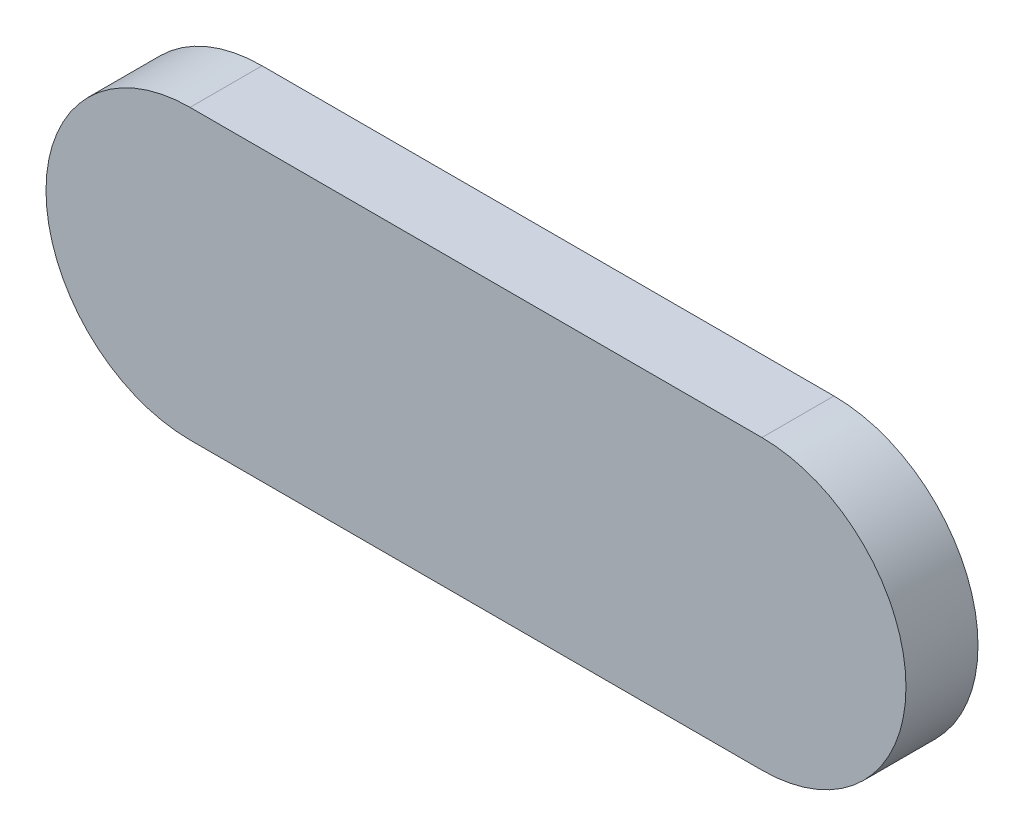
ISO-10303-21;
HEADER;
FILE_DESCRIPTION(('STEP AP214'),'2;1');
FILE_NAME('part.step','',(''),(''),'','','');
FILE_SCHEMA(('AUTOMOTIVE_DESIGN { 1 0 10303 214 1 1 1 1 }'));
ENDSEC;
DATA;
#1=APPLICATION_CONTEXT('core data for automotive mechanical design processes');
#2=APPLICATION_PROTOCOL_DEFINITION('international standard','automotive_design',2000,#1);
#3=PRODUCT_CONTEXT('',#1,'mechanical');
#4=PRODUCT('Part','Part','',(#3));
#5=PRODUCT_RELATED_PRODUCT_CATEGORY('part','',(#4));
#6=PRODUCT_DEFINITION_FORMATION('','',#4);
#7=PRODUCT_DEFINITION_CONTEXT('part definition',#1,'design');
#8=PRODUCT_DEFINITION('design','',#6,#7);
#9=PRODUCT_DEFINITION_SHAPE('','',#8);
#10=(LENGTH_UNIT() NAMED_UNIT(*) SI_UNIT(.MILLI.,.METRE.));
#11=(NAMED_UNIT(*) PLANE_ANGLE_UNIT() SI_UNIT($,.RADIAN.));
#12=(NAMED_UNIT(*) SI_UNIT($,.STERADIAN.) SOLID_ANGLE_UNIT());
#13=UNCERTAINTY_MEASURE_WITH_UNIT(LENGTH_MEASURE(1.E-05),#10,'distance_accuracy_value','');
#14=(GEOMETRIC_REPRESENTATION_CONTEXT(3) GLOBAL_UNCERTAINTY_ASSIGNED_CONTEXT((#13)) GLOBAL_UNIT_ASSIGNED_CONTEXT((#10,
#11,#12)) REPRESENTATION_CONTEXT('',''));
#15=CARTESIAN_POINT('',(0.,0.,0.));
#16=DIRECTION('',(0.,0.,1.));
#17=DIRECTION('',(1.,0.,0.));
#18=AXIS2_PLACEMENT_3D('',#15,#16,#17);
#19=CARTESIAN_POINT('',(-19.85,10.,5.));
#20=DIRECTION('',(0.,1.,0.));
#21=DIRECTION('',(0.,0.,1.));
#22=AXIS2_PLACEMENT_3D('',#19,#20,#21);
#23=PLANE('',#22);
#24=DIRECTION('',(1.,0.,0.));
#25=VECTOR('',#24,1.);
#26=CARTESIAN_POINT('',(-19.85,10.,0.));
#27=LINE('',#26,#25);
#28=CARTESIAN_POINT('',(-19.85,10.,0.));
#29=VERTEX_POINT('',#28);
#30=CARTESIAN_POINT('',(19.85,10.,0.));
#31=VERTEX_POINT('',#30);
#32=EDGE_CURVE('E106',#29,#31,#27,.T.);
#33=ORIENTED_EDGE('',*,*,#32,.F.);
#34=DIRECTION('',(0.,0.,-1.));
#35=VECTOR('',#34,1.);
#36=CARTESIAN_POINT('',(-19.85,10.,5.));
#37=LINE('',#36,#35);
#38=CARTESIAN_POINT('',(-19.85,10.,5.));
#39=VERTEX_POINT('',#38);
#40=EDGE_CURVE('E11',#39,#29,#37,.T.);
#41=ORIENTED_EDGE('',*,*,#40,.F.);
#42=DIRECTION('',(1.,0.,0.));
#43=VECTOR('',#42,1.);
#44=CARTESIAN_POINT('',(-19.85,10.,5.));
#45=LINE('',#44,#43);
#46=CARTESIAN_POINT('',(19.85,10.,5.));
#47=VERTEX_POINT('',#46);
#48=EDGE_CURVE('E101',#39,#47,#45,.T.);
#49=ORIENTED_EDGE('',*,*,#48,.T.);
#50=DIRECTION('',(0.,0.,-1.));
#51=VECTOR('',#50,1.);
#52=CARTESIAN_POINT('',(19.85,10.,5.));
#53=LINE('',#52,#51);
#54=EDGE_CURVE('E44',#47,#31,#53,.T.);
#55=ORIENTED_EDGE('',*,*,#54,.T.);
#56=EDGE_LOOP('',(#33,#41,#49,#55));
#57=FACE_BOUND('',#56,.T.);
#58=ADVANCED_FACE('F41',(#57),#23,.T.);
#59=CARTESIAN_POINT('',(-19.85,0.,5.));
#60=DIRECTION('',(0.,0.,-1.));
#61=DIRECTION('',(-1.,0.,0.));
#62=AXIS2_PLACEMENT_3D('',#59,#60,#61);
#63=CYLINDRICAL_SURFACE('',#62,10.);
#64=CARTESIAN_POINT('',(-19.85,0.,0.));
#65=DIRECTION('',(0.,0.,1.));
#66=DIRECTION('',(1.,0.,0.));
#67=AXIS2_PLACEMENT_3D('',#64,#65,#66);
#68=CIRCLE('',#67,10.);
#69=CARTESIAN_POINT('',(-19.85,-10.,0.));
#70=VERTEX_POINT('',#69);
#71=EDGE_CURVE('E74',#29,#70,#68,.T.);
#72=ORIENTED_EDGE('',*,*,#71,.T.);
#73=DIRECTION('',(0.,0.,-1.));
#74=VECTOR('',#73,1.);
#75=CARTESIAN_POINT('',(-19.85,-10.,5.));
#76=LINE('',#75,#74);
#77=CARTESIAN_POINT('',(-19.85,-10.,5.));
#78=VERTEX_POINT('',#77);
#79=EDGE_CURVE('E50',#78,#70,#76,.T.);
#80=ORIENTED_EDGE('',*,*,#79,.F.);
#81=CARTESIAN_POINT('',(-19.85,0.,5.));
#82=DIRECTION('',(0.,0.,1.));
#83=DIRECTION('',(1.,0.,0.));
#84=AXIS2_PLACEMENT_3D('',#81,#82,#83);
#85=CIRCLE('',#84,10.);
#86=EDGE_CURVE('E89',#39,#78,#85,.T.);
#87=ORIENTED_EDGE('',*,*,#86,.F.);
#88=ORIENTED_EDGE('',*,*,#40,.T.);
#89=EDGE_LOOP('',(#72,#80,#87,#88));
#90=FACE_BOUND('',#89,.T.);
#91=ADVANCED_FACE('F116',(#90),#63,.T.);
#92=CARTESIAN_POINT('',(-19.85,-10.,5.));
#93=DIRECTION('',(0.,1.,0.));
#94=DIRECTION('',(0.,0.,1.));
#95=AXIS2_PLACEMENT_3D('',#92,#93,#94);
#96=PLANE('',#95);
#97=DIRECTION('',(1.,0.,0.));
#98=VECTOR('',#97,1.);
#99=CARTESIAN_POINT('',(-19.85,-10.,0.));
#100=LINE('',#99,#98);
#101=CARTESIAN_POINT('',(19.85,-10.,0.));
#102=VERTEX_POINT('',#101);
#103=EDGE_CURVE('E96',#70,#102,#100,.T.);
#104=ORIENTED_EDGE('',*,*,#103,.T.);
#105=DIRECTION('',(0.,0.,-1.));
#106=VECTOR('',#105,1.);
#107=CARTESIAN_POINT('',(19.85,-10.,5.));
#108=LINE('',#107,#106);
#109=CARTESIAN_POINT('',(19.85,-10.,5.));
#110=VERTEX_POINT('',#109);
#111=EDGE_CURVE('E93',#110,#102,#108,.T.);
#112=ORIENTED_EDGE('',*,*,#111,.F.);
#113=DIRECTION('',(1.,0.,0.));
#114=VECTOR('',#113,1.);
#115=CARTESIAN_POINT('',(-19.85,-10.,5.));
#116=LINE('',#115,#114);
#117=EDGE_CURVE('E86',#78,#110,#116,.T.);
#118=ORIENTED_EDGE('',*,*,#117,.F.);
#119=ORIENTED_EDGE('',*,*,#79,.T.);
#120=EDGE_LOOP('',(#104,#112,#118,#119));
#121=FACE_BOUND('',#120,.T.);
#122=ADVANCED_FACE('F94',(#121),#96,.F.);
#123=CARTESIAN_POINT('',(19.85,0.,5.));
#124=DIRECTION('',(0.,0.,-1.));
#125=DIRECTION('',(-1.,0.,0.));
#126=AXIS2_PLACEMENT_3D('',#123,#124,#125);
#127=CYLINDRICAL_SURFACE('',#126,10.);
#128=CARTESIAN_POINT('',(19.85,0.,0.));
#129=DIRECTION('',(0.,0.,1.));
#130=DIRECTION('',(1.,0.,0.));
#131=AXIS2_PLACEMENT_3D('',#128,#129,#130);
#132=CIRCLE('',#131,10.);
#133=EDGE_CURVE('E109',#102,#31,#132,.T.);
#134=ORIENTED_EDGE('',*,*,#133,.T.);
#135=ORIENTED_EDGE('',*,*,#54,.F.);
#136=CARTESIAN_POINT('',(19.85,0.,5.));
#137=DIRECTION('',(0.,0.,1.));
#138=DIRECTION('',(1.,0.,0.));
#139=AXIS2_PLACEMENT_3D('',#136,#137,#138);
#140=CIRCLE('',#139,10.);
#141=EDGE_CURVE('E83',#110,#47,#140,.T.);
#142=ORIENTED_EDGE('',*,*,#141,.F.);
#143=ORIENTED_EDGE('',*,*,#111,.T.);
#144=EDGE_LOOP('',(#134,#135,#142,#143));
#145=FACE_BOUND('',#144,.T.);
#146=ADVANCED_FACE('F100',(#145),#127,.T.);
#147=CARTESIAN_POINT('',(19.85,0.,5.));
#148=DIRECTION('',(0.,0.,1.));
#149=DIRECTION('',(1.,0.,0.));
#150=AXIS2_PLACEMENT_3D('',#147,#148,#149);
#151=PLANE('',#150);
#152=ORIENTED_EDGE('',*,*,#48,.F.);
#153=ORIENTED_EDGE('',*,*,#86,.T.);
#154=ORIENTED_EDGE('',*,*,#117,.T.);
#155=ORIENTED_EDGE('',*,*,#141,.T.);
#156=EDGE_LOOP('',(#152,#153,#154,#155));
#157=FACE_BOUND('',#156,.T.);
#158=ADVANCED_FACE('F88',(#157),#151,.T.);
#159=CARTESIAN_POINT('',(19.85,0.,0.));
#160=DIRECTION('',(0.,0.,1.));
#161=DIRECTION('',(1.,0.,0.));
#162=AXIS2_PLACEMENT_3D('',#159,#160,#161);
#163=PLANE('',#162);
#164=ORIENTED_EDGE('',*,*,#32,.T.);
#165=ORIENTED_EDGE('',*,*,#133,.F.);
#166=ORIENTED_EDGE('',*,*,#103,.F.);
#167=ORIENTED_EDGE('',*,*,#71,.F.);
#168=EDGE_LOOP('',(#164,#165,#166,#167));
#169=FACE_BOUND('',#168,.T.);
#170=ADVANCED_FACE('F114',(#169),#163,.F.);
#171=CLOSED_SHELL('',(#58,#91,#122,#146,#158,#170));
#172=MANIFOLD_SOLID_BREP('B2',#171);
#173=ADVANCED_BREP_SHAPE_REPRESENTATION('',(#18,#172),#14);
#174=SHAPE_DEFINITION_REPRESENTATION(#9,#173);
ENDSEC;
END-ISO-10303-21;
